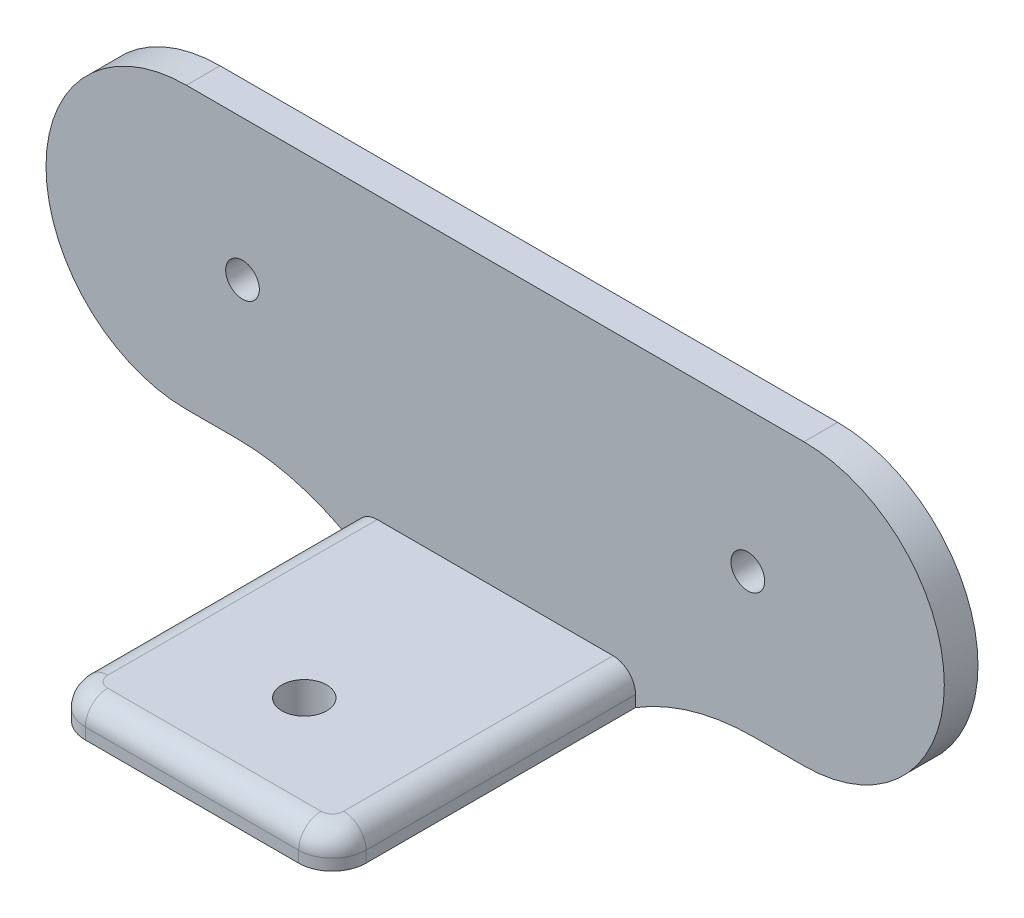
ISO-10303-21;
HEADER;
FILE_DESCRIPTION(('STEP AP214'),'2;1');
FILE_NAME('part.step','',(''),(''),'','','');
FILE_SCHEMA(('AUTOMOTIVE_DESIGN { 1 0 10303 214 1 1 1 1 }'));
ENDSEC;
DATA;
#1=APPLICATION_CONTEXT('core data for automotive mechanical design processes');
#2=APPLICATION_PROTOCOL_DEFINITION('international standard','automotive_design',2000,#1);
#3=PRODUCT_CONTEXT('',#1,'mechanical');
#4=PRODUCT('Part','Part','',(#3));
#5=PRODUCT_RELATED_PRODUCT_CATEGORY('part','',(#4));
#6=PRODUCT_DEFINITION_FORMATION('','',#4);
#7=PRODUCT_DEFINITION_CONTEXT('part definition',#1,'design');
#8=PRODUCT_DEFINITION('design','',#6,#7);
#9=PRODUCT_DEFINITION_SHAPE('','',#8);
#10=(LENGTH_UNIT() NAMED_UNIT(*) SI_UNIT(.MILLI.,.METRE.));
#11=(NAMED_UNIT(*) PLANE_ANGLE_UNIT() SI_UNIT($,.RADIAN.));
#12=(NAMED_UNIT(*) SI_UNIT($,.STERADIAN.) SOLID_ANGLE_UNIT());
#13=UNCERTAINTY_MEASURE_WITH_UNIT(LENGTH_MEASURE(1.E-05),#10,'distance_accuracy_value','');
#14=(GEOMETRIC_REPRESENTATION_CONTEXT(3) GLOBAL_UNCERTAINTY_ASSIGNED_CONTEXT((#13)) GLOBAL_UNIT_ASSIGNED_CONTEXT((#10,
#11,#12)) REPRESENTATION_CONTEXT('',''));
#15=CARTESIAN_POINT('',(0.,0.,0.));
#16=DIRECTION('',(0.,0.,1.));
#17=DIRECTION('',(1.,0.,0.));
#18=AXIS2_PLACEMENT_3D('',#15,#16,#17);
#19=CARTESIAN_POINT('',(27.5,-25.,3.));
#20=DIRECTION('',(0.,1.,0.));
#21=DIRECTION('',(0.,0.,1.));
#22=AXIS2_PLACEMENT_3D('',#19,#20,#21);
#23=PLANE('',#22);
#24=DIRECTION('',(1.,0.,0.));
#25=VECTOR('',#24,1.);
#26=CARTESIAN_POINT('',(27.5,-25.,0.));
#27=LINE('',#26,#25);
#28=CARTESIAN_POINT('',(-27.5,-25.,0.));
#29=VERTEX_POINT('',#28);
#30=CARTESIAN_POINT('',(-23.0356537528527,-25.,0.));
#31=VERTEX_POINT('',#30);
#32=EDGE_CURVE('E260',#29,#31,#27,.T.);
#33=ORIENTED_EDGE('',*,*,#32,.T.);
#34=DIRECTION('',(0.,0.,1.));
#35=VECTOR('',#34,1.);
#36=CARTESIAN_POINT('',(-23.0356537528527,-25.,3.));
#37=LINE('',#36,#35);
#38=CARTESIAN_POINT('',(-23.0356537528527,-25.,3.));
#39=VERTEX_POINT('',#38);
#40=EDGE_CURVE('E161',#31,#39,#37,.T.);
#41=ORIENTED_EDGE('',*,*,#40,.T.);
#42=DIRECTION('',(1.,0.,0.));
#43=VECTOR('',#42,1.);
#44=CARTESIAN_POINT('',(27.5,-25.,3.));
#45=LINE('',#44,#43);
#46=CARTESIAN_POINT('',(-27.5,-25.,3.));
#47=VERTEX_POINT('',#46);
#48=EDGE_CURVE('E245',#47,#39,#45,.T.);
#49=ORIENTED_EDGE('',*,*,#48,.F.);
#50=DIRECTION('',(0.,0.,-1.));
#51=VECTOR('',#50,1.);
#52=CARTESIAN_POINT('',(-27.5,-25.,3.));
#53=LINE('',#52,#51);
#54=EDGE_CURVE('E279',#47,#29,#53,.T.);
#55=ORIENTED_EDGE('',*,*,#54,.T.);
#56=EDGE_LOOP('',(#33,#41,#49,#55));
#57=FACE_BOUND('',#56,.T.);
#58=ADVANCED_FACE('F39',(#57),#23,.F.);
#59=CARTESIAN_POINT('',(23.0356537528527,-25.,3.));
#60=VERTEX_POINT('',#59);
#61=CARTESIAN_POINT('',(27.5,-25.,3.));
#62=VERTEX_POINT('',#61);
#63=EDGE_CURVE('E243',#60,#62,#45,.T.);
#64=ORIENTED_EDGE('',*,*,#63,.F.);
#65=DIRECTION('',(0.,0.,-1.));
#66=VECTOR('',#65,1.);
#67=CARTESIAN_POINT('',(23.0356537528527,-25.,3.));
#68=LINE('',#67,#66);
#69=CARTESIAN_POINT('',(23.0356537528527,-25.,0.));
#70=VERTEX_POINT('',#69);
#71=EDGE_CURVE('E287',#60,#70,#68,.T.);
#72=ORIENTED_EDGE('',*,*,#71,.T.);
#73=CARTESIAN_POINT('',(27.5,-25.,0.));
#74=VERTEX_POINT('',#73);
#75=EDGE_CURVE('E259',#70,#74,#27,.T.);
#76=ORIENTED_EDGE('',*,*,#75,.T.);
#77=DIRECTION('',(0.,0.,-1.));
#78=VECTOR('',#77,1.);
#79=CARTESIAN_POINT('',(27.5,-25.,3.));
#80=LINE('',#79,#78);
#81=EDGE_CURVE('E275',#62,#74,#80,.T.);
#82=ORIENTED_EDGE('',*,*,#81,.F.);
#83=EDGE_LOOP('',(#64,#72,#76,#82));
#84=FACE_BOUND('',#83,.T.);
#85=ADVANCED_FACE('F376',(#84),#23,.F.);
#86=CARTESIAN_POINT('',(-27.5,-12.5,3.));
#87=DIRECTION('',(0.,0.,-1.));
#88=DIRECTION('',(-1.,0.,0.));
#89=AXIS2_PLACEMENT_3D('',#86,#87,#88);
#90=CYLINDRICAL_SURFACE('',#89,12.5);
#91=CARTESIAN_POINT('',(-27.5,-12.5,0.));
#92=DIRECTION('',(0.,0.,1.));
#93=DIRECTION('',(-1.,0.,0.));
#94=AXIS2_PLACEMENT_3D('',#91,#92,#93);
#95=CIRCLE('',#94,12.5);
#96=CARTESIAN_POINT('',(-27.5,0.,0.));
#97=VERTEX_POINT('',#96);
#98=EDGE_CURVE('E227',#97,#29,#95,.T.);
#99=ORIENTED_EDGE('',*,*,#98,.T.);
#100=ORIENTED_EDGE('',*,*,#54,.F.);
#101=CARTESIAN_POINT('',(-27.5,-12.5,3.));
#102=DIRECTION('',(0.,0.,1.));
#103=DIRECTION('',(-1.,0.,0.));
#104=AXIS2_PLACEMENT_3D('',#101,#102,#103);
#105=CIRCLE('',#104,12.5);
#106=CARTESIAN_POINT('',(-27.5,0.,3.));
#107=VERTEX_POINT('',#106);
#108=EDGE_CURVE('E239',#107,#47,#105,.T.);
#109=ORIENTED_EDGE('',*,*,#108,.F.);
#110=DIRECTION('',(0.,0.,-1.));
#111=VECTOR('',#110,1.);
#112=CARTESIAN_POINT('',(-27.5,0.,3.));
#113=LINE('',#112,#111);
#114=EDGE_CURVE('E255',#107,#97,#113,.T.);
#115=ORIENTED_EDGE('',*,*,#114,.T.);
#116=EDGE_LOOP('',(#99,#100,#109,#115));
#117=FACE_BOUND('',#116,.T.);
#118=ADVANCED_FACE('F382',(#117),#90,.T.);
#119=CARTESIAN_POINT('',(27.5,-12.5,3.));
#120=DIRECTION('',(0.,0.,-1.));
#121=DIRECTION('',(-1.,0.,0.));
#122=AXIS2_PLACEMENT_3D('',#119,#120,#121);
#123=CYLINDRICAL_SURFACE('',#122,12.5);
#124=CARTESIAN_POINT('',(27.5,-12.5,0.));
#125=DIRECTION('',(0.,0.,1.));
#126=DIRECTION('',(-1.,0.,0.));
#127=AXIS2_PLACEMENT_3D('',#124,#125,#126);
#128=CIRCLE('',#127,12.5);
#129=CARTESIAN_POINT('',(27.5,0.,0.));
#130=VERTEX_POINT('',#129);
#131=EDGE_CURVE('E263',#74,#130,#128,.T.);
#132=ORIENTED_EDGE('',*,*,#131,.T.);
#133=DIRECTION('',(0.,0.,-1.));
#134=VECTOR('',#133,1.);
#135=CARTESIAN_POINT('',(27.5,0.,3.));
#136=LINE('',#135,#134);
#137=CARTESIAN_POINT('',(27.5,0.,3.));
#138=VERTEX_POINT('',#137);
#139=EDGE_CURVE('E271',#138,#130,#136,.T.);
#140=ORIENTED_EDGE('',*,*,#139,.F.);
#141=CARTESIAN_POINT('',(27.5,-12.5,3.));
#142=DIRECTION('',(0.,0.,1.));
#143=DIRECTION('',(-1.,0.,0.));
#144=AXIS2_PLACEMENT_3D('',#141,#142,#143);
#145=CIRCLE('',#144,12.5);
#146=EDGE_CURVE('E249',#62,#138,#145,.T.);
#147=ORIENTED_EDGE('',*,*,#146,.F.);
#148=ORIENTED_EDGE('',*,*,#81,.T.);
#149=EDGE_LOOP('',(#132,#140,#147,#148));
#150=FACE_BOUND('',#149,.T.);
#151=ADVANCED_FACE('F386',(#150),#123,.T.);
#152=CARTESIAN_POINT('',(-27.5,0.,3.));
#153=DIRECTION('',(0.,-1.,0.));
#154=DIRECTION('',(0.,0.,-1.));
#155=AXIS2_PLACEMENT_3D('',#152,#153,#154);
#156=PLANE('',#155);
#157=DIRECTION('',(-1.,0.,0.));
#158=VECTOR('',#157,1.);
#159=CARTESIAN_POINT('',(-27.5,0.,0.));
#160=LINE('',#159,#158);
#161=EDGE_CURVE('E244',#130,#97,#160,.T.);
#162=ORIENTED_EDGE('',*,*,#161,.T.);
#163=ORIENTED_EDGE('',*,*,#114,.F.);
#164=DIRECTION('',(-1.,0.,0.));
#165=VECTOR('',#164,1.);
#166=CARTESIAN_POINT('',(-27.5,0.,3.));
#167=LINE('',#166,#165);
#168=EDGE_CURVE('E252',#138,#107,#167,.T.);
#169=ORIENTED_EDGE('',*,*,#168,.F.);
#170=ORIENTED_EDGE('',*,*,#139,.T.);
#171=EDGE_LOOP('',(#162,#163,#169,#170));
#172=FACE_BOUND('',#171,.T.);
#173=ADVANCED_FACE('F550',(#172),#156,.F.);
#174=CARTESIAN_POINT('',(-27.5,-12.5,3.));
#175=DIRECTION('',(0.,0.,-1.));
#176=DIRECTION('',(-1.,0.,0.));
#177=AXIS2_PLACEMENT_3D('',#174,#175,#176);
#178=PLANE('',#177);
#179=CARTESIAN_POINT('',(-22.5,-12.5,3.));
#180=DIRECTION('',(0.,0.,1.));
#181=DIRECTION('',(1.,0.,0.));
#182=AXIS2_PLACEMENT_3D('',#179,#180,#181);
#183=CIRCLE('',#182,1.5);
#184=CARTESIAN_POINT('',(-21.,-12.5,3.));
#185=VERTEX_POINT('',#184);
#186=EDGE_CURVE('E228',#185,#185,#183,.T.);
#187=ORIENTED_EDGE('',*,*,#186,.F.);
#188=EDGE_LOOP('',(#187));
#189=FACE_BOUND('',#188,.T.);
#190=CARTESIAN_POINT('',(22.5,-12.5,3.));
#191=DIRECTION('',(0.,0.,1.));
#192=DIRECTION('',(1.,0.,0.));
#193=AXIS2_PLACEMENT_3D('',#190,#191,#192);
#194=CIRCLE('',#193,1.5);
#195=CARTESIAN_POINT('',(24.,-12.5,3.));
#196=VERTEX_POINT('',#195);
#197=EDGE_CURVE('E222',#196,#196,#194,.T.);
#198=ORIENTED_EDGE('',*,*,#197,.F.);
#199=EDGE_LOOP('',(#198));
#200=FACE_BOUND('',#199,.T.);
#201=ORIENTED_EDGE('',*,*,#108,.T.);
#202=ORIENTED_EDGE('',*,*,#48,.T.);
#203=CARTESIAN_POINT('',(-23.0356537528527,-45.,3.));
#204=DIRECTION('',(0.,0.,-1.));
#205=DIRECTION('',(-1.,0.,0.));
#206=AXIS2_PLACEMENT_3D('',#203,#204,#205);
#207=CIRCLE('',#206,20.);
#208=CARTESIAN_POINT('',(-12.5,-28.,3.));
#209=VERTEX_POINT('',#208);
#210=EDGE_CURVE('E166',#39,#209,#207,.T.);
#211=ORIENTED_EDGE('',*,*,#210,.T.);
#212=DIRECTION('',(0.,-1.,0.));
#213=VECTOR('',#212,1.);
#214=CARTESIAN_POINT('',(-12.5,-12.5,3.));
#215=LINE('',#214,#213);
#216=CARTESIAN_POINT('',(-12.5,-27.,3.));
#217=VERTEX_POINT('',#216);
#218=EDGE_CURVE('E290',#217,#209,#215,.T.);
#219=ORIENTED_EDGE('',*,*,#218,.F.);
#220=CARTESIAN_POINT('',(-10.5,-27.,3.));
#221=DIRECTION('',(0.,0.,-1.));
#222=DIRECTION('',(-1.,0.,0.));
#223=AXIS2_PLACEMENT_3D('',#220,#221,#222);
#224=CIRCLE('',#223,2.);
#225=CARTESIAN_POINT('',(-10.5,-25.,3.));
#226=VERTEX_POINT('',#225);
#227=EDGE_CURVE('E11',#217,#226,#224,.T.);
#228=ORIENTED_EDGE('',*,*,#227,.T.);
#229=DIRECTION('',(1.,0.,0.));
#230=VECTOR('',#229,1.);
#231=CARTESIAN_POINT('',(-27.5,-25.,3.));
#232=LINE('',#231,#230);
#233=CARTESIAN_POINT('',(10.5,-25.,3.));
#234=VERTEX_POINT('',#233);
#235=EDGE_CURVE('E218',#226,#234,#232,.T.);
#236=ORIENTED_EDGE('',*,*,#235,.T.);
#237=CARTESIAN_POINT('',(10.5,-27.,3.));
#238=DIRECTION('',(0.,0.,-1.));
#239=DIRECTION('',(-1.,0.,0.));
#240=AXIS2_PLACEMENT_3D('',#237,#238,#239);
#241=CIRCLE('',#240,2.);
#242=CARTESIAN_POINT('',(12.5,-27.,3.));
#243=VERTEX_POINT('',#242);
#244=EDGE_CURVE('E49',#234,#243,#241,.T.);
#245=ORIENTED_EDGE('',*,*,#244,.T.);
#246=DIRECTION('',(0.,1.,0.));
#247=VECTOR('',#246,1.);
#248=CARTESIAN_POINT('',(12.5,-12.5,3.));
#249=LINE('',#248,#247);
#250=CARTESIAN_POINT('',(12.5,-28.,3.));
#251=VERTEX_POINT('',#250);
#252=EDGE_CURVE('E283',#251,#243,#249,.T.);
#253=ORIENTED_EDGE('',*,*,#252,.F.);
#254=CARTESIAN_POINT('',(23.0356537528527,-45.,3.));
#255=DIRECTION('',(0.,0.,-1.));
#256=DIRECTION('',(-1.,0.,0.));
#257=AXIS2_PLACEMENT_3D('',#254,#255,#256);
#258=CIRCLE('',#257,20.);
#259=EDGE_CURVE('E295',#251,#60,#258,.T.);
#260=ORIENTED_EDGE('',*,*,#259,.T.);
#261=ORIENTED_EDGE('',*,*,#63,.T.);
#262=ORIENTED_EDGE('',*,*,#146,.T.);
#263=ORIENTED_EDGE('',*,*,#168,.T.);
#264=EDGE_LOOP('',(#201,#202,#211,#219,#228,#236,#245,#253,#260,#261,#262,#263));
#265=FACE_BOUND('',#264,.T.);
#266=ADVANCED_FACE('F517',(#189,#200,#265),#178,.F.);
#267=CARTESIAN_POINT('',(-27.5,-12.5,0.));
#268=DIRECTION('',(0.,0.,-1.));
#269=DIRECTION('',(-1.,0.,0.));
#270=AXIS2_PLACEMENT_3D('',#267,#268,#269);
#271=PLANE('',#270);
#272=CARTESIAN_POINT('',(-22.5,-12.5,0.));
#273=DIRECTION('',(0.,0.,1.));
#274=DIRECTION('',(1.,0.,0.));
#275=AXIS2_PLACEMENT_3D('',#272,#273,#274);
#276=CIRCLE('',#275,1.5);
#277=CARTESIAN_POINT('',(-21.,-12.5,0.));
#278=VERTEX_POINT('',#277);
#279=EDGE_CURVE('E223',#278,#278,#276,.T.);
#280=ORIENTED_EDGE('',*,*,#279,.T.);
#281=EDGE_LOOP('',(#280));
#282=FACE_BOUND('',#281,.T.);
#283=CARTESIAN_POINT('',(22.5,-12.5,0.));
#284=DIRECTION('',(0.,0.,1.));
#285=DIRECTION('',(1.,0.,0.));
#286=AXIS2_PLACEMENT_3D('',#283,#284,#285);
#287=CIRCLE('',#286,1.5);
#288=CARTESIAN_POINT('',(24.,-12.5,0.));
#289=VERTEX_POINT('',#288);
#290=EDGE_CURVE('E232',#289,#289,#287,.T.);
#291=ORIENTED_EDGE('',*,*,#290,.T.);
#292=EDGE_LOOP('',(#291));
#293=FACE_BOUND('',#292,.T.);
#294=ORIENTED_EDGE('',*,*,#98,.F.);
#295=ORIENTED_EDGE('',*,*,#161,.F.);
#296=ORIENTED_EDGE('',*,*,#131,.F.);
#297=ORIENTED_EDGE('',*,*,#75,.F.);
#298=CARTESIAN_POINT('',(23.0356537528527,-45.,0.));
#299=DIRECTION('',(0.,0.,-1.));
#300=DIRECTION('',(-1.,0.,0.));
#301=AXIS2_PLACEMENT_3D('',#298,#299,#300);
#302=CIRCLE('',#301,20.);
#303=CARTESIAN_POINT('',(12.5,-28.,0.));
#304=VERTEX_POINT('',#303);
#305=EDGE_CURVE('E167',#70,#304,#302,.F.);
#306=ORIENTED_EDGE('',*,*,#305,.T.);
#307=DIRECTION('',(1.,0.,0.));
#308=VECTOR('',#307,1.);
#309=CARTESIAN_POINT('',(-12.5,-28.,0.));
#310=LINE('',#309,#308);
#311=CARTESIAN_POINT('',(-12.5,-28.,0.));
#312=VERTEX_POINT('',#311);
#313=EDGE_CURVE('E174',#312,#304,#310,.T.);
#314=ORIENTED_EDGE('',*,*,#313,.F.);
#315=CARTESIAN_POINT('',(-23.0356537528527,-45.,0.));
#316=DIRECTION('',(0.,0.,-1.));
#317=DIRECTION('',(-1.,0.,0.));
#318=AXIS2_PLACEMENT_3D('',#315,#316,#317);
#319=CIRCLE('',#318,20.);
#320=EDGE_CURVE('E156',#312,#31,#319,.F.);
#321=ORIENTED_EDGE('',*,*,#320,.T.);
#322=ORIENTED_EDGE('',*,*,#32,.F.);
#323=EDGE_LOOP('',(#294,#295,#296,#297,#306,#314,#321,#322));
#324=FACE_BOUND('',#323,.T.);
#325=ADVANCED_FACE('F182',(#282,#293,#324),#271,.T.);
#326=CARTESIAN_POINT('',(22.5,-12.5,0.));
#327=DIRECTION('',(0.,0.,1.));
#328=DIRECTION('',(1.,0.,0.));
#329=AXIS2_PLACEMENT_3D('',#326,#327,#328);
#330=CYLINDRICAL_SURFACE('',#329,1.5);
#331=ORIENTED_EDGE('',*,*,#290,.F.);
#332=EDGE_LOOP('',(#331));
#333=FACE_BOUND('',#332,.T.);
#334=ORIENTED_EDGE('',*,*,#197,.T.);
#335=EDGE_LOOP('',(#334));
#336=FACE_BOUND('',#335,.T.);
#337=ADVANCED_FACE('F516',(#333,#336),#330,.F.);
#338=CARTESIAN_POINT('',(-22.5,-12.5,0.));
#339=DIRECTION('',(0.,0.,1.));
#340=DIRECTION('',(1.,0.,0.));
#341=AXIS2_PLACEMENT_3D('',#338,#339,#340);
#342=CYLINDRICAL_SURFACE('',#341,1.5);
#343=ORIENTED_EDGE('',*,*,#279,.F.);
#344=EDGE_LOOP('',(#343));
#345=FACE_BOUND('',#344,.T.);
#346=ORIENTED_EDGE('',*,*,#186,.T.);
#347=EDGE_LOOP('',(#346));
#348=FACE_BOUND('',#347,.T.);
#349=ADVANCED_FACE('F507',(#345,#348),#342,.F.);
#350=CARTESIAN_POINT('',(-9.5,-25.,27.));
#351=DIRECTION('',(0.,1.,0.));
#352=DIRECTION('',(0.,0.,1.));
#353=AXIS2_PLACEMENT_3D('',#350,#351,#352);
#354=PLANE('',#353);
#355=CARTESIAN_POINT('',(0.,-25.,20.));
#356=DIRECTION('',(0.,1.,0.));
#357=DIRECTION('',(0.,0.,1.));
#358=AXIS2_PLACEMENT_3D('',#355,#356,#357);
#359=CIRCLE('',#358,2.);
#360=CARTESIAN_POINT('',(0.,-25.,22.));
#361=VERTEX_POINT('',#360);
#362=EDGE_CURVE('E349',#361,#361,#359,.T.);
#363=ORIENTED_EDGE('',*,*,#362,.F.);
#364=EDGE_LOOP('',(#363));
#365=FACE_BOUND('',#364,.T.);
#366=CARTESIAN_POINT('',(9.5,-25.,27.));
#367=DIRECTION('',(0.,1.,0.));
#368=DIRECTION('',(0.,0.,1.));
#369=AXIS2_PLACEMENT_3D('',#366,#367,#368);
#370=CIRCLE('',#369,0.999999999999999);
#371=CARTESIAN_POINT('',(9.5,-25.,28.));
#372=VERTEX_POINT('',#371);
#373=CARTESIAN_POINT('',(10.5,-25.,27.));
#374=VERTEX_POINT('',#373);
#375=EDGE_CURVE('E316',#372,#374,#370,.T.);
#376=ORIENTED_EDGE('',*,*,#375,.T.);
#377=DIRECTION('',(0.,0.,1.));
#378=VECTOR('',#377,1.);
#379=CARTESIAN_POINT('',(10.5,-25.,3.));
#380=LINE('',#379,#378);
#381=EDGE_CURVE('E319',#374,#234,#380,.F.);
#382=ORIENTED_EDGE('',*,*,#381,.T.);
#383=ORIENTED_EDGE('',*,*,#235,.F.);
#384=DIRECTION('',(0.,0.,-1.));
#385=VECTOR('',#384,1.);
#386=CARTESIAN_POINT('',(-10.5,-25.,27.));
#387=LINE('',#386,#385);
#388=CARTESIAN_POINT('',(-10.5,-25.,27.));
#389=VERTEX_POINT('',#388);
#390=EDGE_CURVE('E307',#226,#389,#387,.F.);
#391=ORIENTED_EDGE('',*,*,#390,.T.);
#392=CARTESIAN_POINT('',(-9.5,-25.,27.));
#393=DIRECTION('',(0.,1.,0.));
#394=DIRECTION('',(0.,0.,1.));
#395=AXIS2_PLACEMENT_3D('',#392,#393,#394);
#396=CIRCLE('',#395,0.999999999999999);
#397=CARTESIAN_POINT('',(-9.5,-25.,28.));
#398=VERTEX_POINT('',#397);
#399=EDGE_CURVE('E310',#389,#398,#396,.T.);
#400=ORIENTED_EDGE('',*,*,#399,.T.);
#401=DIRECTION('',(-1.,0.,0.));
#402=VECTOR('',#401,1.);
#403=CARTESIAN_POINT('',(9.5,-25.,28.));
#404=LINE('',#403,#402);
#405=EDGE_CURVE('E313',#398,#372,#404,.F.);
#406=ORIENTED_EDGE('',*,*,#405,.T.);
#407=EDGE_LOOP('',(#376,#382,#383,#391,#400,#406));
#408=FACE_BOUND('',#407,.T.);
#409=ADVANCED_FACE('F499',(#365,#408),#354,.T.);
#410=CARTESIAN_POINT('',(-12.5,-28.,0.));
#411=DIRECTION('',(1.,0.,0.));
#412=DIRECTION('',(0.,0.,-1.));
#413=AXIS2_PLACEMENT_3D('',#410,#411,#412);
#414=PLANE('',#413);
#415=DIRECTION('',(0.,1.,0.));
#416=VECTOR('',#415,1.);
#417=CARTESIAN_POINT('',(-12.5,-28.,27.));
#418=LINE('',#417,#416);
#419=CARTESIAN_POINT('',(-12.5,-28.,27.));
#420=VERTEX_POINT('',#419);
#421=CARTESIAN_POINT('',(-12.5,-27.,27.));
#422=VERTEX_POINT('',#421);
#423=EDGE_CURVE('E204',#420,#422,#418,.T.);
#424=ORIENTED_EDGE('',*,*,#423,.T.);
#425=DIRECTION('',(0.,0.,-1.));
#426=VECTOR('',#425,1.);
#427=CARTESIAN_POINT('',(-12.5,-27.,3.));
#428=LINE('',#427,#426);
#429=EDGE_CURVE('E57',#422,#217,#428,.T.);
#430=ORIENTED_EDGE('',*,*,#429,.T.);
#431=ORIENTED_EDGE('',*,*,#218,.T.);
#432=DIRECTION('',(0.,0.,-1.));
#433=VECTOR('',#432,1.);
#434=CARTESIAN_POINT('',(-12.5,-28.,0.));
#435=LINE('',#434,#433);
#436=EDGE_CURVE('E177',#420,#209,#435,.T.);
#437=ORIENTED_EDGE('',*,*,#436,.F.);
#438=EDGE_LOOP('',(#424,#430,#431,#437));
#439=FACE_BOUND('',#438,.T.);
#440=ADVANCED_FACE('F490',(#439),#414,.F.);
#441=CARTESIAN_POINT('',(12.5,-28.,0.));
#442=DIRECTION('',(-1.,0.,0.));
#443=DIRECTION('',(0.,0.,1.));
#444=AXIS2_PLACEMENT_3D('',#441,#442,#443);
#445=PLANE('',#444);
#446=ORIENTED_EDGE('',*,*,#252,.T.);
#447=DIRECTION('',(0.,0.,1.));
#448=VECTOR('',#447,1.);
#449=CARTESIAN_POINT('',(12.5,-27.,27.));
#450=LINE('',#449,#448);
#451=CARTESIAN_POINT('',(12.5,-27.,27.));
#452=VERTEX_POINT('',#451);
#453=EDGE_CURVE('E303',#243,#452,#450,.T.);
#454=ORIENTED_EDGE('',*,*,#453,.T.);
#455=DIRECTION('',(0.,1.,0.));
#456=VECTOR('',#455,1.);
#457=CARTESIAN_POINT('',(12.5,-28.,27.));
#458=LINE('',#457,#456);
#459=CARTESIAN_POINT('',(12.5,-28.,27.));
#460=VERTEX_POINT('',#459);
#461=EDGE_CURVE('E214',#460,#452,#458,.T.);
#462=ORIENTED_EDGE('',*,*,#461,.F.);
#463=DIRECTION('',(0.,0.,1.));
#464=VECTOR('',#463,1.);
#465=CARTESIAN_POINT('',(12.5,-28.,0.));
#466=LINE('',#465,#464);
#467=EDGE_CURVE('E186',#251,#460,#466,.T.);
#468=ORIENTED_EDGE('',*,*,#467,.F.);
#469=EDGE_LOOP('',(#446,#454,#462,#468));
#470=FACE_BOUND('',#469,.T.);
#471=ADVANCED_FACE('F481',(#470),#445,.F.);
#472=CARTESIAN_POINT('',(9.5,-28.,27.));
#473=DIRECTION('',(0.,1.,0.));
#474=DIRECTION('',(0.,0.,1.));
#475=AXIS2_PLACEMENT_3D('',#472,#473,#474);
#476=CYLINDRICAL_SURFACE('',#475,3.);
#477=ORIENTED_EDGE('',*,*,#461,.T.);
#478=CARTESIAN_POINT('',(9.5,-27.,27.));
#479=DIRECTION('',(0.,1.,0.));
#480=DIRECTION('',(0.,0.,1.));
#481=AXIS2_PLACEMENT_3D('',#478,#479,#480);
#482=CIRCLE('',#481,3.);
#483=CARTESIAN_POINT('',(9.5,-27.,30.));
#484=VERTEX_POINT('',#483);
#485=EDGE_CURVE('E322',#452,#484,#482,.F.);
#486=ORIENTED_EDGE('',*,*,#485,.T.);
#487=DIRECTION('',(0.,1.,0.));
#488=VECTOR('',#487,1.);
#489=CARTESIAN_POINT('',(9.5,-28.,30.));
#490=LINE('',#489,#488);
#491=CARTESIAN_POINT('',(9.5,-28.,30.));
#492=VERTEX_POINT('',#491);
#493=EDGE_CURVE('E210',#492,#484,#490,.T.);
#494=ORIENTED_EDGE('',*,*,#493,.F.);
#495=CARTESIAN_POINT('',(9.5,-28.,27.));
#496=DIRECTION('',(0.,-1.,0.));
#497=DIRECTION('',(0.,0.,1.));
#498=AXIS2_PLACEMENT_3D('',#495,#496,#497);
#499=CIRCLE('',#498,3.);
#500=EDGE_CURVE('E195',#460,#492,#499,.T.);
#501=ORIENTED_EDGE('',*,*,#500,.F.);
#502=EDGE_LOOP('',(#477,#486,#494,#501));
#503=FACE_BOUND('',#502,.T.);
#504=ADVANCED_FACE('F472',(#503),#476,.T.);
#505=CARTESIAN_POINT('',(-9.5,-28.,30.));
#506=DIRECTION('',(0.,0.,-1.));
#507=DIRECTION('',(-1.,0.,0.));
#508=AXIS2_PLACEMENT_3D('',#505,#506,#507);
#509=PLANE('',#508);
#510=ORIENTED_EDGE('',*,*,#493,.T.);
#511=DIRECTION('',(-1.,0.,0.));
#512=VECTOR('',#511,1.);
#513=CARTESIAN_POINT('',(-9.5,-27.,30.));
#514=LINE('',#513,#512);
#515=CARTESIAN_POINT('',(-9.5,-27.,30.));
#516=VERTEX_POINT('',#515);
#517=EDGE_CURVE('E325',#484,#516,#514,.T.);
#518=ORIENTED_EDGE('',*,*,#517,.T.);
#519=DIRECTION('',(0.,1.,0.));
#520=VECTOR('',#519,1.);
#521=CARTESIAN_POINT('',(-9.5,-28.,30.));
#522=LINE('',#521,#520);
#523=CARTESIAN_POINT('',(-9.5,-28.,30.));
#524=VERTEX_POINT('',#523);
#525=EDGE_CURVE('E207',#524,#516,#522,.T.);
#526=ORIENTED_EDGE('',*,*,#525,.F.);
#527=DIRECTION('',(-1.,0.,0.));
#528=VECTOR('',#527,1.);
#529=CARTESIAN_POINT('',(-9.5,-28.,30.));
#530=LINE('',#529,#528);
#531=EDGE_CURVE('E198',#492,#524,#530,.T.);
#532=ORIENTED_EDGE('',*,*,#531,.F.);
#533=EDGE_LOOP('',(#510,#518,#526,#532));
#534=FACE_BOUND('',#533,.T.);
#535=ADVANCED_FACE('F464',(#534),#509,.F.);
#536=CARTESIAN_POINT('',(-9.5,-28.,27.));
#537=DIRECTION('',(0.,1.,0.));
#538=DIRECTION('',(0.,0.,1.));
#539=AXIS2_PLACEMENT_3D('',#536,#537,#538);
#540=CYLINDRICAL_SURFACE('',#539,3.);
#541=ORIENTED_EDGE('',*,*,#525,.T.);
#542=CARTESIAN_POINT('',(-9.5,-27.,27.));
#543=DIRECTION('',(0.,1.,0.));
#544=DIRECTION('',(0.,0.,1.));
#545=AXIS2_PLACEMENT_3D('',#542,#543,#544);
#546=CIRCLE('',#545,3.);
#547=EDGE_CURVE('E65',#516,#422,#546,.F.);
#548=ORIENTED_EDGE('',*,*,#547,.T.);
#549=ORIENTED_EDGE('',*,*,#423,.F.);
#550=CARTESIAN_POINT('',(-9.5,-28.,27.));
#551=DIRECTION('',(0.,-1.,0.));
#552=DIRECTION('',(0.,0.,1.));
#553=AXIS2_PLACEMENT_3D('',#550,#551,#552);
#554=CIRCLE('',#553,3.);
#555=EDGE_CURVE('E201',#524,#420,#554,.T.);
#556=ORIENTED_EDGE('',*,*,#555,.F.);
#557=EDGE_LOOP('',(#541,#548,#549,#556));
#558=FACE_BOUND('',#557,.T.);
#559=ADVANCED_FACE('F458',(#558),#540,.T.);
#560=CARTESIAN_POINT('',(-9.5,-28.,27.));
#561=DIRECTION('',(0.,1.,0.));
#562=DIRECTION('',(0.,0.,1.));
#563=AXIS2_PLACEMENT_3D('',#560,#561,#562);
#564=PLANE('',#563);
#565=CARTESIAN_POINT('',(0.,-28.,20.));
#566=DIRECTION('',(0.,1.,0.));
#567=DIRECTION('',(0.,0.,1.));
#568=AXIS2_PLACEMENT_3D('',#565,#566,#567);
#569=CIRCLE('',#568,2.);
#570=CARTESIAN_POINT('',(0.,-28.,22.));
#571=VERTEX_POINT('',#570);
#572=EDGE_CURVE('E179',#571,#571,#569,.T.);
#573=ORIENTED_EDGE('',*,*,#572,.T.);
#574=EDGE_LOOP('',(#573));
#575=FACE_BOUND('',#574,.T.);
#576=ORIENTED_EDGE('',*,*,#436,.T.);
#577=EDGE_CURVE('E160',#209,#312,#435,.T.);
#578=ORIENTED_EDGE('',*,*,#577,.T.);
#579=ORIENTED_EDGE('',*,*,#313,.T.);
#580=EDGE_CURVE('E190',#304,#251,#466,.T.);
#581=ORIENTED_EDGE('',*,*,#580,.T.);
#582=ORIENTED_EDGE('',*,*,#467,.T.);
#583=ORIENTED_EDGE('',*,*,#500,.T.);
#584=ORIENTED_EDGE('',*,*,#531,.T.);
#585=ORIENTED_EDGE('',*,*,#555,.T.);
#586=EDGE_LOOP('',(#576,#578,#579,#581,#582,#583,#584,#585));
#587=FACE_BOUND('',#586,.T.);
#588=ADVANCED_FACE('F172',(#575,#587),#564,.F.);
#589=CARTESIAN_POINT('',(23.0356537528527,-45.,0.));
#590=DIRECTION('',(0.,0.,-1.));
#591=DIRECTION('',(-1.,0.,0.));
#592=AXIS2_PLACEMENT_3D('',#589,#590,#591);
#593=CYLINDRICAL_SURFACE('',#592,20.);
#594=ORIENTED_EDGE('',*,*,#305,.F.);
#595=ORIENTED_EDGE('',*,*,#71,.F.);
#596=ORIENTED_EDGE('',*,*,#259,.F.);
#597=ORIENTED_EDGE('',*,*,#580,.F.);
#598=EDGE_LOOP('',(#594,#595,#596,#597));
#599=FACE_BOUND('',#598,.T.);
#600=ADVANCED_FACE('F372',(#599),#593,.F.);
#601=CARTESIAN_POINT('',(-23.0356537528527,-45.,0.));
#602=DIRECTION('',(0.,0.,1.));
#603=DIRECTION('',(1.,0.,0.));
#604=AXIS2_PLACEMENT_3D('',#601,#602,#603);
#605=CYLINDRICAL_SURFACE('',#604,20.);
#606=ORIENTED_EDGE('',*,*,#210,.F.);
#607=ORIENTED_EDGE('',*,*,#40,.F.);
#608=ORIENTED_EDGE('',*,*,#320,.F.);
#609=ORIENTED_EDGE('',*,*,#577,.F.);
#610=EDGE_LOOP('',(#606,#607,#608,#609));
#611=FACE_BOUND('',#610,.T.);
#612=ADVANCED_FACE('F159',(#611),#605,.F.);
#613=CARTESIAN_POINT('',(0.,-28.,20.));
#614=DIRECTION('',(0.,1.,0.));
#615=DIRECTION('',(0.,0.,1.));
#616=AXIS2_PLACEMENT_3D('',#613,#614,#615);
#617=CYLINDRICAL_SURFACE('',#616,2.);
#618=ORIENTED_EDGE('',*,*,#572,.F.);
#619=EDGE_LOOP('',(#618));
#620=FACE_BOUND('',#619,.T.);
#621=ORIENTED_EDGE('',*,*,#362,.T.);
#622=EDGE_LOOP('',(#621));
#623=FACE_BOUND('',#622,.T.);
#624=ADVANCED_FACE('F363',(#620,#623),#617,.F.);
#625=CARTESIAN_POINT('',(-10.5,-27.,0.));
#626=DIRECTION('',(0.,0.,1.));
#627=DIRECTION('',(1.,0.,0.));
#628=AXIS2_PLACEMENT_3D('',#625,#626,#627);
#629=CYLINDRICAL_SURFACE('',#628,2.);
#630=ORIENTED_EDGE('',*,*,#227,.F.);
#631=ORIENTED_EDGE('',*,*,#429,.F.);
#632=CARTESIAN_POINT('',(-10.5,-27.,27.));
#633=DIRECTION('',(0.,0.,1.));
#634=DIRECTION('',(1.,0.,0.));
#635=AXIS2_PLACEMENT_3D('',#632,#633,#634);
#636=CIRCLE('',#635,2.);
#637=EDGE_CURVE('E43',#389,#422,#636,.T.);
#638=ORIENTED_EDGE('',*,*,#637,.F.);
#639=ORIENTED_EDGE('',*,*,#390,.F.);
#640=EDGE_LOOP('',(#630,#631,#638,#639));
#641=FACE_BOUND('',#640,.T.);
#642=ADVANCED_FACE('F41',(#641),#629,.T.);
#643=CARTESIAN_POINT('',(-9.5,-27.,27.));
#644=DIRECTION('',(0.,1.,0.));
#645=DIRECTION('',(0.,0.,1.));
#646=AXIS2_PLACEMENT_3D('',#643,#644,#645);
#647=DEGENERATE_TOROIDAL_SURFACE('',#646,0.999999999999999,2.,.T.);
#648=ORIENTED_EDGE('',*,*,#637,.T.);
#649=ORIENTED_EDGE('',*,*,#547,.F.);
#650=CARTESIAN_POINT('',(-9.5,-27.,28.));
#651=DIRECTION('',(1.,0.,0.));
#652=DIRECTION('',(0.,0.,-1.));
#653=AXIS2_PLACEMENT_3D('',#650,#651,#652);
#654=CIRCLE('',#653,2.);
#655=EDGE_CURVE('E340',#398,#516,#654,.T.);
#656=ORIENTED_EDGE('',*,*,#655,.F.);
#657=ORIENTED_EDGE('',*,*,#399,.F.);
#658=EDGE_LOOP('',(#648,#649,#656,#657));
#659=FACE_BOUND('',#658,.T.);
#660=ADVANCED_FACE('F370',(#659),#647,.T.);
#661=CARTESIAN_POINT('',(-9.5,-27.,28.));
#662=DIRECTION('',(1.,0.,0.));
#663=DIRECTION('',(0.,0.,-1.));
#664=AXIS2_PLACEMENT_3D('',#661,#662,#663);
#665=CYLINDRICAL_SURFACE('',#664,2.);
#666=ORIENTED_EDGE('',*,*,#655,.T.);
#667=ORIENTED_EDGE('',*,*,#517,.F.);
#668=CARTESIAN_POINT('',(9.5,-27.,28.));
#669=DIRECTION('',(1.,0.,0.));
#670=DIRECTION('',(0.,0.,-1.));
#671=AXIS2_PLACEMENT_3D('',#668,#669,#670);
#672=CIRCLE('',#671,2.);
#673=EDGE_CURVE('E337',#372,#484,#672,.T.);
#674=ORIENTED_EDGE('',*,*,#673,.F.);
#675=ORIENTED_EDGE('',*,*,#405,.F.);
#676=EDGE_LOOP('',(#666,#667,#674,#675));
#677=FACE_BOUND('',#676,.T.);
#678=ADVANCED_FACE('F401',(#677),#665,.T.);
#679=CARTESIAN_POINT('',(9.5,-27.,27.));
#680=DIRECTION('',(0.,1.,0.));
#681=DIRECTION('',(0.,0.,1.));
#682=AXIS2_PLACEMENT_3D('',#679,#680,#681);
#683=DEGENERATE_TOROIDAL_SURFACE('',#682,0.999999999999999,2.,.T.);
#684=ORIENTED_EDGE('',*,*,#673,.T.);
#685=ORIENTED_EDGE('',*,*,#485,.F.);
#686=CARTESIAN_POINT('',(10.5,-27.,27.));
#687=DIRECTION('',(0.,0.,-1.));
#688=DIRECTION('',(-1.,0.,0.));
#689=AXIS2_PLACEMENT_3D('',#686,#687,#688);
#690=CIRCLE('',#689,2.);
#691=EDGE_CURVE('E334',#374,#452,#690,.T.);
#692=ORIENTED_EDGE('',*,*,#691,.F.);
#693=ORIENTED_EDGE('',*,*,#375,.F.);
#694=EDGE_LOOP('',(#684,#685,#692,#693));
#695=FACE_BOUND('',#694,.T.);
#696=ADVANCED_FACE('F397',(#695),#683,.T.);
#697=CARTESIAN_POINT('',(10.5,-27.,0.));
#698=DIRECTION('',(0.,0.,-1.));
#699=DIRECTION('',(-1.,0.,0.));
#700=AXIS2_PLACEMENT_3D('',#697,#698,#699);
#701=CYLINDRICAL_SURFACE('',#700,2.);
#702=ORIENTED_EDGE('',*,*,#244,.F.);
#703=ORIENTED_EDGE('',*,*,#381,.F.);
#704=ORIENTED_EDGE('',*,*,#691,.T.);
#705=ORIENTED_EDGE('',*,*,#453,.F.);
#706=EDGE_LOOP('',(#702,#703,#704,#705));
#707=FACE_BOUND('',#706,.T.);
#708=ADVANCED_FACE('F394',(#707),#701,.T.);
#709=CLOSED_SHELL('',(#58,#85,#118,#151,#173,#266,#325,#337,#349,#409,#440,#471,#504,#535,#559,
#588,#600,#612,#624,#642,#660,#678,#696,#708));
#710=MANIFOLD_SOLID_BREP('B2',#709);
#711=ADVANCED_BREP_SHAPE_REPRESENTATION('',(#18,#710),#14);
#712=SHAPE_DEFINITION_REPRESENTATION(#9,#711);
ENDSEC;
END-ISO-10303-21;
